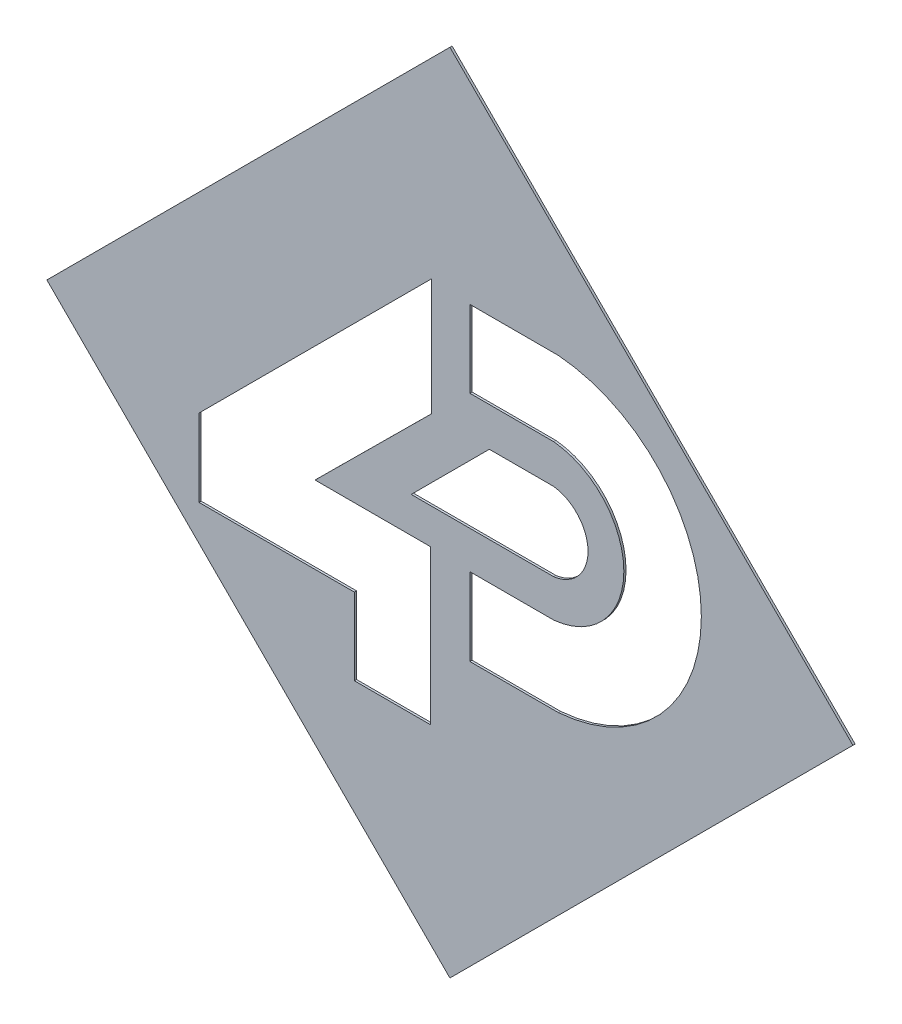
ISO-10303-21;
HEADER;
FILE_DESCRIPTION(('STEP AP214'),'2;1');
FILE_NAME('part.step','',(''),(''),'','','');
FILE_SCHEMA(('AUTOMOTIVE_DESIGN { 1 0 10303 214 1 1 1 1 }'));
ENDSEC;
DATA;
#1=APPLICATION_CONTEXT('core data for automotive mechanical design processes');
#2=APPLICATION_PROTOCOL_DEFINITION('international standard','automotive_design',2000,#1);
#3=PRODUCT_CONTEXT('',#1,'mechanical');
#4=PRODUCT('Part','Part','',(#3));
#5=PRODUCT_RELATED_PRODUCT_CATEGORY('part','',(#4));
#6=PRODUCT_DEFINITION_FORMATION('','',#4);
#7=PRODUCT_DEFINITION_CONTEXT('part definition',#1,'design');
#8=PRODUCT_DEFINITION('design','',#6,#7);
#9=PRODUCT_DEFINITION_SHAPE('','',#8);
#10=(LENGTH_UNIT() NAMED_UNIT(*) SI_UNIT(.MILLI.,.METRE.));
#11=(NAMED_UNIT(*) PLANE_ANGLE_UNIT() SI_UNIT($,.RADIAN.));
#12=(NAMED_UNIT(*) SI_UNIT($,.STERADIAN.) SOLID_ANGLE_UNIT());
#13=UNCERTAINTY_MEASURE_WITH_UNIT(LENGTH_MEASURE(1.E-05),#10,'distance_accuracy_value','');
#14=(GEOMETRIC_REPRESENTATION_CONTEXT(3) GLOBAL_UNCERTAINTY_ASSIGNED_CONTEXT((#13)) GLOBAL_UNIT_ASSIGNED_CONTEXT((#10,
#11,#12)) REPRESENTATION_CONTEXT('',''));
#15=CARTESIAN_POINT('',(0.,0.,0.));
#16=DIRECTION('',(0.,0.,1.));
#17=DIRECTION('',(1.,0.,0.));
#18=AXIS2_PLACEMENT_3D('',#15,#16,#17);
#19=CARTESIAN_POINT('',(10.217731417077,-10.2224459157152,0.));
#20=DIRECTION('',(0.,0.,1.));
#21=DIRECTION('',(1.,0.,0.));
#22=AXIS2_PLACEMENT_3D('',#19,#20,#21);
#23=PLANE('',#22);
#24=DIRECTION('',(0.,1.,0.));
#25=VECTOR('',#24,1.);
#26=CARTESIAN_POINT('',(10.6752695397316,-10.2224459157152,0.));
#27=LINE('',#26,#25);
#28=CARTESIAN_POINT('',(10.6752695397316,12.814151480448,0.));
#29=VERTEX_POINT('',#28);
#30=CARTESIAN_POINT('',(10.6752695397316,14.577178869165,0.));
#31=VERTEX_POINT('',#30);
#32=EDGE_CURVE('E146',#29,#31,#27,.T.);
#33=ORIENTED_EDGE('',*,*,#32,.F.);
#34=DIRECTION('',(1.,0.,0.));
#35=VECTOR('',#34,1.);
#36=CARTESIAN_POINT('',(10.217731417077,12.814151480448,0.));
#37=LINE('',#36,#35);
#38=CARTESIAN_POINT('',(12.5966622651888,12.814151480448,0.));
#39=VERTEX_POINT('',#38);
#40=EDGE_CURVE('E140',#39,#29,#37,.F.);
#41=ORIENTED_EDGE('',*,*,#40,.F.);
#42=CARTESIAN_POINT('',(12.4230260176183,11.0454761003808,0.));
#43=DIRECTION('',(0.,0.,-1.));
#44=DIRECTION('',(-1.,0.,0.));
#45=AXIS2_PLACEMENT_3D('',#42,#43,#44);
#46=CIRCLE('',#45,1.77717814147213);
#47=CARTESIAN_POINT('',(12.5966622651889,9.27680072031354,0.));
#48=VERTEX_POINT('',#47);
#49=EDGE_CURVE('E199',#48,#39,#46,.F.);
#50=ORIENTED_EDGE('',*,*,#49,.F.);
#51=DIRECTION('',(1.,0.,0.));
#52=VECTOR('',#51,1.);
#53=CARTESIAN_POINT('',(10.217731417077,9.27680072031354,0.));
#54=LINE('',#53,#52);
#55=CARTESIAN_POINT('',(10.6752695397316,9.27680072031354,0.));
#56=VERTEX_POINT('',#55);
#57=EDGE_CURVE('E158',#56,#48,#54,.T.);
#58=ORIENTED_EDGE('',*,*,#57,.F.);
#59=DIRECTION('',(0.,1.,0.));
#60=VECTOR('',#59,1.);
#61=CARTESIAN_POINT('',(10.6752695397316,-10.2224459157152,0.));
#62=LINE('',#61,#60);
#63=CARTESIAN_POINT('',(10.6752695397316,7.4957965885246,0.));
#64=VERTEX_POINT('',#63);
#65=EDGE_CURVE('E165',#64,#56,#62,.T.);
#66=ORIENTED_EDGE('',*,*,#65,.F.);
#67=DIRECTION('',(1.,0.,0.));
#68=VECTOR('',#67,1.);
#69=CARTESIAN_POINT('',(10.217731417077,7.4957965885246,0.));
#70=LINE('',#69,#68);
#71=CARTESIAN_POINT('',(12.7010926173601,7.4957965885246,0.));
#72=VERTEX_POINT('',#71);
#73=EDGE_CURVE('E171',#72,#64,#70,.F.);
#74=ORIENTED_EDGE('',*,*,#73,.F.);
#75=CARTESIAN_POINT('',(12.4228208807988,11.0364877288448,0.));
#76=DIRECTION('',(0.,0.,-1.));
#77=DIRECTION('',(-1.,0.,0.));
#78=AXIS2_PLACEMENT_3D('',#75,#76,#77);
#79=CIRCLE('',#78,3.55160934092007);
#80=CARTESIAN_POINT('',(12.7010926173602,14.577178869165,0.));
#81=VERTEX_POINT('',#80);
#82=EDGE_CURVE('E174',#72,#81,#79,.F.);
#83=ORIENTED_EDGE('',*,*,#82,.T.);
#84=DIRECTION('',(1.,0.,0.));
#85=VECTOR('',#84,1.);
#86=CARTESIAN_POINT('',(10.217731417077,14.577178869165,0.));
#87=LINE('',#86,#85);
#88=EDGE_CURVE('E152',#31,#81,#87,.T.);
#89=ORIENTED_EDGE('',*,*,#88,.F.);
#90=EDGE_LOOP('',(#33,#41,#50,#58,#66,#74,#83,#89));
#91=FACE_BOUND('',#90,.T.);
#92=DIRECTION('',(-0.707106781186548,-0.707106781186548,0.));
#93=VECTOR('',#92,1.);
#94=CARTESIAN_POINT('',(-2.42633022734762,2.42161572870947,0.));
#95=LINE('',#94,#93);
#96=CARTESIAN_POINT('',(9.79216750616329,14.6401134622204,0.));
#97=VERTEX_POINT('',#96);
#98=CARTESIAN_POINT('',(4.47357688341058,9.32152283946767,0.));
#99=VERTEX_POINT('',#98);
#100=EDGE_CURVE('E155',#97,#99,#95,.T.);
#101=ORIENTED_EDGE('',*,*,#100,.T.);
#102=DIRECTION('',(0.,1.,0.));
#103=VECTOR('',#102,1.);
#104=CARTESIAN_POINT('',(4.47357688341058,-10.2224459157152,0.));
#105=LINE('',#104,#103);
#106=CARTESIAN_POINT('',(4.47357688341058,7.54950829680011,0.));
#107=VERTEX_POINT('',#106);
#108=EDGE_CURVE('E223',#99,#107,#105,.F.);
#109=ORIENTED_EDGE('',*,*,#108,.T.);
#110=DIRECTION('',(1.,0.,0.));
#111=VECTOR('',#110,1.);
#112=CARTESIAN_POINT('',(10.217731417077,7.54950829680011,0.));
#113=LINE('',#112,#111);
#114=CARTESIAN_POINT('',(8.03181049413783,7.54950829680011,0.));
#115=VERTEX_POINT('',#114);
#116=EDGE_CURVE('E229',#107,#115,#113,.T.);
#117=ORIENTED_EDGE('',*,*,#116,.T.);
#118=DIRECTION('',(0.,1.,0.));
#119=VECTOR('',#118,1.);
#120=CARTESIAN_POINT('',(8.03181049413783,-10.2224459157152,0.));
#121=LINE('',#120,#119);
#122=CARTESIAN_POINT('',(8.03181049413783,5.79169827952468,0.));
#123=VERTEX_POINT('',#122);
#124=EDGE_CURVE('E238',#123,#115,#121,.T.);
#125=ORIENTED_EDGE('',*,*,#124,.F.);
#126=DIRECTION('',(1.,0.,0.));
#127=VECTOR('',#126,1.);
#128=CARTESIAN_POINT('',(10.217731417077,5.79169827952468,0.));
#129=LINE('',#128,#127);
#130=CARTESIAN_POINT('',(9.7718648546731,5.79169827952468,0.));
#131=VERTEX_POINT('',#130);
#132=EDGE_CURVE('E244',#131,#123,#129,.F.);
#133=ORIENTED_EDGE('',*,*,#132,.F.);
#134=DIRECTION('',(0.,1.,0.));
#135=VECTOR('',#134,1.);
#136=CARTESIAN_POINT('',(9.7718648546731,-10.2224459157152,0.));
#137=LINE('',#136,#135);
#138=CARTESIAN_POINT('',(9.7718648546731,9.32152283946767,0.));
#139=VERTEX_POINT('',#138);
#140=EDGE_CURVE('E250',#139,#131,#137,.F.);
#141=ORIENTED_EDGE('',*,*,#140,.F.);
#142=DIRECTION('',(1.,0.,0.));
#143=VECTOR('',#142,1.);
#144=CARTESIAN_POINT('',(10.217731417077,9.32152283946767,0.));
#145=LINE('',#144,#143);
#146=CARTESIAN_POINT('',(7.12982313173791,9.32152283946767,0.));
#147=VERTEX_POINT('',#146);
#148=EDGE_CURVE('E256',#147,#139,#145,.T.);
#149=ORIENTED_EDGE('',*,*,#148,.F.);
#150=DIRECTION('',(0.709780855705061,0.704422555625948,0.));
#151=VECTOR('',#150,1.);
#152=CARTESIAN_POINT('',(-1.08622687419273,1.16749769803277,0.));
#153=LINE('',#152,#151);
#154=CARTESIAN_POINT('',(9.79216750616329,11.9637685595585,0.));
#155=VERTEX_POINT('',#154);
#156=EDGE_CURVE('E259',#147,#155,#153,.T.);
#157=ORIENTED_EDGE('',*,*,#156,.T.);
#158=DIRECTION('',(0.,1.,0.));
#159=VECTOR('',#158,1.);
#160=CARTESIAN_POINT('',(9.79216750616329,-10.2224459157152,0.));
#161=LINE('',#160,#159);
#162=EDGE_CURVE('E265',#155,#97,#161,.T.);
#163=ORIENTED_EDGE('',*,*,#162,.T.);
#164=EDGE_LOOP('',(#101,#109,#117,#125,#133,#141,#149,#157,#163));
#165=FACE_BOUND('',#164,.T.);
#166=DIRECTION('',(0.707106781186547,0.707106781186548,0.));
#167=VECTOR('',#166,1.);
#168=CARTESIAN_POINT('',(-4.61658621500734,4.61187171636918,0.));
#169=LINE('',#168,#167);
#170=CARTESIAN_POINT('',(0.990477070848462,10.218935002225,0.));
#171=VERTEX_POINT('',#170);
#172=CARTESIAN_POINT('',(10.217731417077,19.4461893484536,0.));
#173=VERTEX_POINT('',#172);
#174=EDGE_CURVE('E268',#171,#173,#169,.T.);
#175=ORIENTED_EDGE('',*,*,#174,.T.);
#176=DIRECTION('',(0.707106781186548,-0.707106781186547,0.));
#177=VECTOR('',#176,1.);
#178=CARTESIAN_POINT('',(25.0520490491614,4.61187171636921,0.));
#179=LINE('',#178,#177);
#180=CARTESIAN_POINT('',(19.4449857633056,10.218935002225,0.));
#181=VERTEX_POINT('',#180);
#182=EDGE_CURVE('E277',#173,#181,#179,.T.);
#183=ORIENTED_EDGE('',*,*,#182,.T.);
#184=DIRECTION('',(-0.707106781186547,-0.707106781186548,0.));
#185=VECTOR('',#184,1.);
#186=CARTESIAN_POINT('',(4.61066813122124,-4.61538262985939,0.));
#187=LINE('',#186,#185);
#188=CARTESIAN_POINT('',(10.2177314170781,0.991680655997479,0.));
#189=VERTEX_POINT('',#188);
#190=EDGE_CURVE('E283',#181,#189,#187,.T.);
#191=ORIENTED_EDGE('',*,*,#190,.T.);
#192=DIRECTION('',(0.707106781186711,-0.707106781186385,0.));
#193=VECTOR('',#192,1.);
#194=CARTESIAN_POINT('',(15.824794702935,-4.61538262985467,0.));
#195=LINE('',#194,#193);
#196=EDGE_CURVE('E180',#171,#189,#195,.T.);
#197=ORIENTED_EDGE('',*,*,#196,.F.);
#198=EDGE_LOOP('',(#175,#183,#191,#197));
#199=FACE_BOUND('',#198,.T.);
#200=DIRECTION('',(-0.707106781186546,-0.707106781186549,0.));
#201=VECTOR('',#200,1.);
#202=CARTESIAN_POINT('',(-0.405234509784962,0.400520011146764,0.));
#203=LINE('',#202,#201);
#204=CARTESIAN_POINT('',(11.1202790704143,11.9260335913461,0.));
#205=VERTEX_POINT('',#204);
#206=CARTESIAN_POINT('',(9.33131784206016,10.1370723629919,0.));
#207=VERTEX_POINT('',#206);
#208=EDGE_CURVE('E136',#205,#207,#203,.T.);
#209=ORIENTED_EDGE('',*,*,#208,.T.);
#210=DIRECTION('',(1.,0.,0.));
#211=VECTOR('',#210,1.);
#212=CARTESIAN_POINT('',(10.217731417077,10.1370723629919,0.));
#213=LINE('',#212,#211);
#214=CARTESIAN_POINT('',(12.5966622651888,10.1370723629919,0.));
#215=VERTEX_POINT('',#214);
#216=EDGE_CURVE('E110',#215,#207,#213,.F.);
#217=ORIENTED_EDGE('',*,*,#216,.F.);
#218=CARTESIAN_POINT('',(12.4775949614775,11.031552977169,0.));
#219=DIRECTION('',(0.,0.,-1.));
#220=DIRECTION('',(-1.,0.,0.));
#221=AXIS2_PLACEMENT_3D('',#218,#219,#220);
#222=CIRCLE('',#221,0.902370540272512);
#223=CARTESIAN_POINT('',(12.5966622651888,11.9260335913461,0.));
#224=VERTEX_POINT('',#223);
#225=EDGE_CURVE('E20',#215,#224,#222,.F.);
#226=ORIENTED_EDGE('',*,*,#225,.T.);
#227=DIRECTION('',(1.,0.,0.));
#228=VECTOR('',#227,1.);
#229=CARTESIAN_POINT('',(10.217731417077,11.9260335913461,0.));
#230=LINE('',#229,#228);
#231=EDGE_CURVE('E115',#224,#205,#230,.F.);
#232=ORIENTED_EDGE('',*,*,#231,.T.);
#233=EDGE_LOOP('',(#209,#217,#226,#232));
#234=FACE_BOUND('',#233,.T.);
#235=ADVANCED_FACE('F17',(#91,#165,#199,#234),#23,.F.);
#236=CARTESIAN_POINT('',(10.217731417077,11.9260335913461,0.05));
#237=DIRECTION('',(0.,1.,0.));
#238=DIRECTION('',(0.,0.,1.));
#239=AXIS2_PLACEMENT_3D('',#236,#237,#238);
#240=PLANE('',#239);
#241=DIRECTION('',(0.,0.,-1.));
#242=VECTOR('',#241,1.);
#243=CARTESIAN_POINT('',(12.5966622651888,11.9260335913461,0.05));
#244=LINE('',#243,#242);
#245=CARTESIAN_POINT('',(12.5966622651889,11.9260335913461,0.05));
#246=VERTEX_POINT('',#245);
#247=EDGE_CURVE('E118',#224,#246,#244,.F.);
#248=ORIENTED_EDGE('',*,*,#247,.T.);
#249=DIRECTION('',(1.,0.,0.));
#250=VECTOR('',#249,1.);
#251=CARTESIAN_POINT('',(10.217731417077,11.9260335913461,0.05));
#252=LINE('',#251,#250);
#253=CARTESIAN_POINT('',(11.1202790704143,11.9260335913461,0.05));
#254=VERTEX_POINT('',#253);
#255=EDGE_CURVE('E198',#254,#246,#252,.T.);
#256=ORIENTED_EDGE('',*,*,#255,.F.);
#257=DIRECTION('',(0.,0.,1.));
#258=VECTOR('',#257,1.);
#259=CARTESIAN_POINT('',(11.1202790704143,11.9260335913461,0.05));
#260=LINE('',#259,#258);
#261=EDGE_CURVE('E121',#254,#205,#260,.F.);
#262=ORIENTED_EDGE('',*,*,#261,.T.);
#263=ORIENTED_EDGE('',*,*,#231,.F.);
#264=EDGE_LOOP('',(#248,#256,#262,#263));
#265=FACE_BOUND('',#264,.T.);
#266=ADVANCED_FACE('F116',(#265),#240,.F.);
#267=CARTESIAN_POINT('',(12.4775949614775,11.031552977169,0.05));
#268=DIRECTION('',(0.,0.,-1.));
#269=DIRECTION('',(-1.,0.,0.));
#270=AXIS2_PLACEMENT_3D('',#267,#268,#269);
#271=CYLINDRICAL_SURFACE('',#270,0.902370540272512);
#272=DIRECTION('',(0.,0.,1.));
#273=VECTOR('',#272,1.);
#274=CARTESIAN_POINT('',(12.5966622651888,10.1370723629919,0.05));
#275=LINE('',#274,#273);
#276=CARTESIAN_POINT('',(12.5966622651888,10.1370723629919,0.05));
#277=VERTEX_POINT('',#276);
#278=EDGE_CURVE('E184',#277,#215,#275,.F.);
#279=ORIENTED_EDGE('',*,*,#278,.F.);
#280=CARTESIAN_POINT('',(12.4775949614775,11.031552977169,0.05));
#281=DIRECTION('',(0.,0.,-1.));
#282=DIRECTION('',(-1.,0.,0.));
#283=AXIS2_PLACEMENT_3D('',#280,#281,#282);
#284=CIRCLE('',#283,0.902370540272512);
#285=EDGE_CURVE('E128',#246,#277,#284,.T.);
#286=ORIENTED_EDGE('',*,*,#285,.F.);
#287=ORIENTED_EDGE('',*,*,#247,.F.);
#288=ORIENTED_EDGE('',*,*,#225,.F.);
#289=EDGE_LOOP('',(#279,#286,#287,#288));
#290=FACE_BOUND('',#289,.T.);
#291=ADVANCED_FACE('F126',(#290),#271,.F.);
#292=CARTESIAN_POINT('',(10.217731417077,10.1370723629919,0.05));
#293=DIRECTION('',(0.,1.,0.));
#294=DIRECTION('',(0.,0.,1.));
#295=AXIS2_PLACEMENT_3D('',#292,#293,#294);
#296=PLANE('',#295);
#297=DIRECTION('',(1.,0.,0.));
#298=VECTOR('',#297,1.);
#299=CARTESIAN_POINT('',(10.217731417077,10.1370723629919,0.05));
#300=LINE('',#299,#298);
#301=CARTESIAN_POINT('',(9.33131784206016,10.1370723629919,0.05));
#302=VERTEX_POINT('',#301);
#303=EDGE_CURVE('E197',#277,#302,#300,.F.);
#304=ORIENTED_EDGE('',*,*,#303,.F.);
#305=ORIENTED_EDGE('',*,*,#278,.T.);
#306=ORIENTED_EDGE('',*,*,#216,.T.);
#307=DIRECTION('',(0.,0.,1.));
#308=VECTOR('',#307,1.);
#309=CARTESIAN_POINT('',(9.33131784206016,10.1370723629919,0.05));
#310=LINE('',#309,#308);
#311=EDGE_CURVE('E137',#207,#302,#310,.T.);
#312=ORIENTED_EDGE('',*,*,#311,.T.);
#313=EDGE_LOOP('',(#304,#305,#306,#312));
#314=FACE_BOUND('',#313,.T.);
#315=ADVANCED_FACE('F301',(#314),#296,.T.);
#316=CARTESIAN_POINT('',(-0.405234509784962,0.400520011146764,0.05));
#317=DIRECTION('',(-0.707106781186549,0.707106781186546,0.));
#318=DIRECTION('',(-0.707106781186546,-0.707106781186549,0.));
#319=AXIS2_PLACEMENT_3D('',#316,#317,#318);
#320=PLANE('',#319);
#321=ORIENTED_EDGE('',*,*,#261,.F.);
#322=DIRECTION('',(0.707106781186546,0.707106781186549,0.));
#323=VECTOR('',#322,1.);
#324=CARTESIAN_POINT('',(9.33131784206017,10.1370723629919,0.05));
#325=LINE('',#324,#323);
#326=EDGE_CURVE('E292',#302,#254,#325,.T.);
#327=ORIENTED_EDGE('',*,*,#326,.F.);
#328=ORIENTED_EDGE('',*,*,#311,.F.);
#329=ORIENTED_EDGE('',*,*,#208,.F.);
#330=EDGE_LOOP('',(#321,#327,#328,#329));
#331=FACE_BOUND('',#330,.T.);
#332=ADVANCED_FACE('F304',(#331),#320,.F.);
#333=CARTESIAN_POINT('',(15.824794702935,-4.61538262985467,0.05));
#334=DIRECTION('',(-0.707106781186385,-0.707106781186711,0.));
#335=DIRECTION('',(0.707106781186711,-0.707106781186385,0.));
#336=AXIS2_PLACEMENT_3D('',#333,#334,#335);
#337=PLANE('',#336);
#338=DIRECTION('',(0.707106781186548,-0.707106781186547,0.));
#339=VECTOR('',#338,1.);
#340=CARTESIAN_POINT('',(0.990477070848459,10.218935002225,0.05));
#341=LINE('',#340,#339);
#342=CARTESIAN_POINT('',(0.990477070848462,10.218935002225,0.05));
#343=VERTEX_POINT('',#342);
#344=CARTESIAN_POINT('',(10.2177314170781,0.991680655997479,0.05));
#345=VERTEX_POINT('',#344);
#346=EDGE_CURVE('E295',#343,#345,#341,.T.);
#347=ORIENTED_EDGE('',*,*,#346,.F.);
#348=DIRECTION('',(0.,0.,1.));
#349=VECTOR('',#348,1.);
#350=CARTESIAN_POINT('',(0.99047707084846,10.218935002225,0.05));
#351=LINE('',#350,#349);
#352=EDGE_CURVE('E271',#343,#171,#351,.F.);
#353=ORIENTED_EDGE('',*,*,#352,.T.);
#354=ORIENTED_EDGE('',*,*,#196,.T.);
#355=DIRECTION('',(0.,0.,1.));
#356=VECTOR('',#355,1.);
#357=CARTESIAN_POINT('',(10.217731417077,0.991680655996416,0.05));
#358=LINE('',#357,#356);
#359=EDGE_CURVE('E286',#189,#345,#358,.T.);
#360=ORIENTED_EDGE('',*,*,#359,.T.);
#361=EDGE_LOOP('',(#347,#353,#354,#360));
#362=FACE_BOUND('',#361,.T.);
#363=ADVANCED_FACE('F403',(#362),#337,.T.);
#364=CARTESIAN_POINT('',(4.61066813122124,-4.61538262985939,0.05));
#365=DIRECTION('',(-0.707106781186548,0.707106781186547,0.));
#366=DIRECTION('',(-0.707106781186547,-0.707106781186548,0.));
#367=AXIS2_PLACEMENT_3D('',#364,#365,#366);
#368=PLANE('',#367);
#369=DIRECTION('',(0.,0.,1.));
#370=VECTOR('',#369,1.);
#371=CARTESIAN_POINT('',(19.4449857633056,10.218935002225,0.05));
#372=LINE('',#371,#370);
#373=CARTESIAN_POINT('',(19.4449857633056,10.218935002225,0.05));
#374=VERTEX_POINT('',#373);
#375=EDGE_CURVE('E280',#181,#374,#372,.T.);
#376=ORIENTED_EDGE('',*,*,#375,.T.);
#377=DIRECTION('',(0.707106781186547,0.707106781186548,0.));
#378=VECTOR('',#377,1.);
#379=CARTESIAN_POINT('',(10.217731417077,0.991680655996415,0.05));
#380=LINE('',#379,#378);
#381=EDGE_CURVE('E391',#345,#374,#380,.T.);
#382=ORIENTED_EDGE('',*,*,#381,.F.);
#383=ORIENTED_EDGE('',*,*,#359,.F.);
#384=ORIENTED_EDGE('',*,*,#190,.F.);
#385=EDGE_LOOP('',(#376,#382,#383,#384));
#386=FACE_BOUND('',#385,.T.);
#387=ADVANCED_FACE('F591',(#386),#368,.F.);
#388=CARTESIAN_POINT('',(25.0520490491614,4.61187171636921,0.05));
#389=DIRECTION('',(-0.707106781186547,-0.707106781186548,0.));
#390=DIRECTION('',(0.707106781186548,-0.707106781186547,0.));
#391=AXIS2_PLACEMENT_3D('',#388,#389,#390);
#392=PLANE('',#391);
#393=DIRECTION('',(0.,0.,1.));
#394=VECTOR('',#393,1.);
#395=CARTESIAN_POINT('',(10.217731417077,19.4461893484536,0.05));
#396=LINE('',#395,#394);
#397=CARTESIAN_POINT('',(10.217731417077,19.4461893484536,0.05));
#398=VERTEX_POINT('',#397);
#399=EDGE_CURVE('E274',#173,#398,#396,.T.);
#400=ORIENTED_EDGE('',*,*,#399,.T.);
#401=DIRECTION('',(-0.707106781186548,0.707106781186547,0.));
#402=VECTOR('',#401,1.);
#403=CARTESIAN_POINT('',(19.4449857633056,10.218935002225,0.05));
#404=LINE('',#403,#402);
#405=EDGE_CURVE('E389',#374,#398,#404,.T.);
#406=ORIENTED_EDGE('',*,*,#405,.F.);
#407=ORIENTED_EDGE('',*,*,#375,.F.);
#408=ORIENTED_EDGE('',*,*,#182,.F.);
#409=EDGE_LOOP('',(#400,#406,#407,#408));
#410=FACE_BOUND('',#409,.T.);
#411=ADVANCED_FACE('F588',(#410),#392,.F.);
#412=CARTESIAN_POINT('',(-4.61658621500734,4.61187171636918,0.05));
#413=DIRECTION('',(0.707106781186548,-0.707106781186547,0.));
#414=DIRECTION('',(0.707106781186547,0.707106781186548,0.));
#415=AXIS2_PLACEMENT_3D('',#412,#413,#414);
#416=PLANE('',#415);
#417=ORIENTED_EDGE('',*,*,#352,.F.);
#418=DIRECTION('',(-0.707106781186547,-0.707106781186548,0.));
#419=VECTOR('',#418,1.);
#420=CARTESIAN_POINT('',(10.217731417077,19.4461893484536,0.05));
#421=LINE('',#420,#419);
#422=EDGE_CURVE('E386',#398,#343,#421,.T.);
#423=ORIENTED_EDGE('',*,*,#422,.F.);
#424=ORIENTED_EDGE('',*,*,#399,.F.);
#425=ORIENTED_EDGE('',*,*,#174,.F.);
#426=EDGE_LOOP('',(#417,#423,#424,#425));
#427=FACE_BOUND('',#426,.T.);
#428=ADVANCED_FACE('F409',(#427),#416,.F.);
#429=CARTESIAN_POINT('',(9.79216750616329,-10.2224459157152,0.05));
#430=DIRECTION('',(1.,0.,0.));
#431=DIRECTION('',(0.,0.,-1.));
#432=AXIS2_PLACEMENT_3D('',#429,#430,#431);
#433=PLANE('',#432);
#434=DIRECTION('',(0.,0.,1.));
#435=VECTOR('',#434,1.);
#436=CARTESIAN_POINT('',(9.7921675061633,11.9637685595585,0.05));
#437=LINE('',#436,#435);
#438=CARTESIAN_POINT('',(9.7921675061633,11.9637685595585,0.05));
#439=VERTEX_POINT('',#438);
#440=EDGE_CURVE('E262',#155,#439,#437,.T.);
#441=ORIENTED_EDGE('',*,*,#440,.T.);
#442=DIRECTION('',(0.,1.,0.));
#443=VECTOR('',#442,1.);
#444=CARTESIAN_POINT('',(9.79216750616329,-10.2224459157152,0.05));
#445=LINE('',#444,#443);
#446=CARTESIAN_POINT('',(9.79216750616329,14.6401134622204,0.05));
#447=VERTEX_POINT('',#446);
#448=EDGE_CURVE('E383',#447,#439,#445,.F.);
#449=ORIENTED_EDGE('',*,*,#448,.F.);
#450=DIRECTION('',(0.,0.,1.));
#451=VECTOR('',#450,1.);
#452=CARTESIAN_POINT('',(9.7921675061633,14.6401134622204,0.05));
#453=LINE('',#452,#451);
#454=EDGE_CURVE('E217',#447,#97,#453,.F.);
#455=ORIENTED_EDGE('',*,*,#454,.T.);
#456=ORIENTED_EDGE('',*,*,#162,.F.);
#457=EDGE_LOOP('',(#441,#449,#455,#456));
#458=FACE_BOUND('',#457,.T.);
#459=ADVANCED_FACE('F488',(#458),#433,.F.);
#460=CARTESIAN_POINT('',(-1.08622687419273,1.16749769803277,0.05));
#461=DIRECTION('',(0.704422555625948,-0.709780855705061,0.));
#462=DIRECTION('',(0.709780855705061,0.704422555625948,0.));
#463=AXIS2_PLACEMENT_3D('',#460,#461,#462);
#464=PLANE('',#463);
#465=DIRECTION('',(0.,0.,-1.));
#466=VECTOR('',#465,1.);
#467=CARTESIAN_POINT('',(7.12982313173791,9.32152283946767,0.05));
#468=LINE('',#467,#466);
#469=CARTESIAN_POINT('',(7.12982313173791,9.32152283946767,0.05));
#470=VERTEX_POINT('',#469);
#471=EDGE_CURVE('E253',#470,#147,#468,.T.);
#472=ORIENTED_EDGE('',*,*,#471,.F.);
#473=DIRECTION('',(-0.709780855705061,-0.704422555625947,0.));
#474=VECTOR('',#473,1.);
#475=CARTESIAN_POINT('',(9.79216750616329,11.9637685595585,0.05));
#476=LINE('',#475,#474);
#477=EDGE_CURVE('E380',#439,#470,#476,.T.);
#478=ORIENTED_EDGE('',*,*,#477,.F.);
#479=ORIENTED_EDGE('',*,*,#440,.F.);
#480=ORIENTED_EDGE('',*,*,#156,.F.);
#481=EDGE_LOOP('',(#472,#478,#479,#480));
#482=FACE_BOUND('',#481,.T.);
#483=ADVANCED_FACE('F492',(#482),#464,.F.);
#484=CARTESIAN_POINT('',(10.217731417077,9.32152283946767,0.05));
#485=DIRECTION('',(0.,-1.,0.));
#486=DIRECTION('',(0.,0.,-1.));
#487=AXIS2_PLACEMENT_3D('',#484,#485,#486);
#488=PLANE('',#487);
#489=DIRECTION('',(1.,0.,0.));
#490=VECTOR('',#489,1.);
#491=CARTESIAN_POINT('',(10.217731417077,9.32152283946767,0.05));
#492=LINE('',#491,#490);
#493=CARTESIAN_POINT('',(9.7718648546731,9.32152283946767,0.05));
#494=VERTEX_POINT('',#493);
#495=EDGE_CURVE('E377',#470,#494,#492,.T.);
#496=ORIENTED_EDGE('',*,*,#495,.F.);
#497=ORIENTED_EDGE('',*,*,#471,.T.);
#498=ORIENTED_EDGE('',*,*,#148,.T.);
#499=DIRECTION('',(0.,0.,1.));
#500=VECTOR('',#499,1.);
#501=CARTESIAN_POINT('',(9.7718648546731,9.32152283946767,0.05));
#502=LINE('',#501,#500);
#503=EDGE_CURVE('E247',#494,#139,#502,.F.);
#504=ORIENTED_EDGE('',*,*,#503,.F.);
#505=EDGE_LOOP('',(#496,#497,#498,#504));
#506=FACE_BOUND('',#505,.T.);
#507=ADVANCED_FACE('F494',(#506),#488,.T.);
#508=CARTESIAN_POINT('',(9.7718648546731,-10.2224459157152,0.05));
#509=DIRECTION('',(-1.,0.,0.));
#510=DIRECTION('',(0.,0.,1.));
#511=AXIS2_PLACEMENT_3D('',#508,#509,#510);
#512=PLANE('',#511);
#513=DIRECTION('',(0.,1.,0.));
#514=VECTOR('',#513,1.);
#515=CARTESIAN_POINT('',(9.7718648546731,-10.2224459157152,0.05));
#516=LINE('',#515,#514);
#517=CARTESIAN_POINT('',(9.7718648546731,5.79169827952468,0.05));
#518=VERTEX_POINT('',#517);
#519=EDGE_CURVE('E374',#494,#518,#516,.F.);
#520=ORIENTED_EDGE('',*,*,#519,.F.);
#521=ORIENTED_EDGE('',*,*,#503,.T.);
#522=ORIENTED_EDGE('',*,*,#140,.T.);
#523=DIRECTION('',(0.,0.,1.));
#524=VECTOR('',#523,1.);
#525=CARTESIAN_POINT('',(9.7718648546731,5.79169827952468,0.05));
#526=LINE('',#525,#524);
#527=EDGE_CURVE('E241',#518,#131,#526,.F.);
#528=ORIENTED_EDGE('',*,*,#527,.F.);
#529=EDGE_LOOP('',(#520,#521,#522,#528));
#530=FACE_BOUND('',#529,.T.);
#531=ADVANCED_FACE('F497',(#530),#512,.T.);
#532=CARTESIAN_POINT('',(10.217731417077,5.79169827952468,0.05));
#533=DIRECTION('',(0.,1.,0.));
#534=DIRECTION('',(0.,0.,1.));
#535=AXIS2_PLACEMENT_3D('',#532,#533,#534);
#536=PLANE('',#535);
#537=DIRECTION('',(1.,0.,0.));
#538=VECTOR('',#537,1.);
#539=CARTESIAN_POINT('',(10.217731417077,5.79169827952468,0.05));
#540=LINE('',#539,#538);
#541=CARTESIAN_POINT('',(8.03181049413783,5.79169827952468,0.05));
#542=VERTEX_POINT('',#541);
#543=EDGE_CURVE('E371',#518,#542,#540,.F.);
#544=ORIENTED_EDGE('',*,*,#543,.F.);
#545=ORIENTED_EDGE('',*,*,#527,.T.);
#546=ORIENTED_EDGE('',*,*,#132,.T.);
#547=DIRECTION('',(0.,0.,-1.));
#548=VECTOR('',#547,1.);
#549=CARTESIAN_POINT('',(8.03181049413783,5.79169827952468,0.05));
#550=LINE('',#549,#548);
#551=EDGE_CURVE('E235',#542,#123,#550,.T.);
#552=ORIENTED_EDGE('',*,*,#551,.F.);
#553=EDGE_LOOP('',(#544,#545,#546,#552));
#554=FACE_BOUND('',#553,.T.);
#555=ADVANCED_FACE('F500',(#554),#536,.T.);
#556=CARTESIAN_POINT('',(8.03181049413783,-10.2224459157152,0.05));
#557=DIRECTION('',(1.,0.,0.));
#558=DIRECTION('',(0.,0.,-1.));
#559=AXIS2_PLACEMENT_3D('',#556,#557,#558);
#560=PLANE('',#559);
#561=DIRECTION('',(0.,1.,0.));
#562=VECTOR('',#561,1.);
#563=CARTESIAN_POINT('',(8.03181049413783,-10.2224459157152,0.05));
#564=LINE('',#563,#562);
#565=CARTESIAN_POINT('',(8.03181049413783,7.54950829680011,0.05));
#566=VERTEX_POINT('',#565);
#567=EDGE_CURVE('E368',#542,#566,#564,.T.);
#568=ORIENTED_EDGE('',*,*,#567,.F.);
#569=ORIENTED_EDGE('',*,*,#551,.T.);
#570=ORIENTED_EDGE('',*,*,#124,.T.);
#571=DIRECTION('',(0.,0.,-1.));
#572=VECTOR('',#571,1.);
#573=CARTESIAN_POINT('',(8.03181049413783,7.54950829680011,0.05));
#574=LINE('',#573,#572);
#575=EDGE_CURVE('E232',#115,#566,#574,.F.);
#576=ORIENTED_EDGE('',*,*,#575,.T.);
#577=EDGE_LOOP('',(#568,#569,#570,#576));
#578=FACE_BOUND('',#577,.T.);
#579=ADVANCED_FACE('F502',(#578),#560,.T.);
#580=CARTESIAN_POINT('',(10.217731417077,7.54950829680011,0.05));
#581=DIRECTION('',(0.,-1.,0.));
#582=DIRECTION('',(0.,0.,-1.));
#583=AXIS2_PLACEMENT_3D('',#580,#581,#582);
#584=PLANE('',#583);
#585=DIRECTION('',(0.,0.,1.));
#586=VECTOR('',#585,1.);
#587=CARTESIAN_POINT('',(4.47357688341058,7.54950829680011,0.05));
#588=LINE('',#587,#586);
#589=CARTESIAN_POINT('',(4.47357688341058,7.54950829680011,0.05));
#590=VERTEX_POINT('',#589);
#591=EDGE_CURVE('E226',#107,#590,#588,.T.);
#592=ORIENTED_EDGE('',*,*,#591,.T.);
#593=DIRECTION('',(1.,0.,0.));
#594=VECTOR('',#593,1.);
#595=CARTESIAN_POINT('',(10.217731417077,7.54950829680011,0.05));
#596=LINE('',#595,#594);
#597=EDGE_CURVE('E365',#566,#590,#596,.F.);
#598=ORIENTED_EDGE('',*,*,#597,.F.);
#599=ORIENTED_EDGE('',*,*,#575,.F.);
#600=ORIENTED_EDGE('',*,*,#116,.F.);
#601=EDGE_LOOP('',(#592,#598,#599,#600));
#602=FACE_BOUND('',#601,.T.);
#603=ADVANCED_FACE('F484',(#602),#584,.F.);
#604=CARTESIAN_POINT('',(4.47357688341058,-10.2224459157152,0.05));
#605=DIRECTION('',(-1.,0.,0.));
#606=DIRECTION('',(0.,0.,1.));
#607=AXIS2_PLACEMENT_3D('',#604,#605,#606);
#608=PLANE('',#607);
#609=DIRECTION('',(0.,0.,1.));
#610=VECTOR('',#609,1.);
#611=CARTESIAN_POINT('',(4.47357688341059,9.32152283946767,0.05));
#612=LINE('',#611,#610);
#613=CARTESIAN_POINT('',(4.47357688341058,9.32152283946767,0.05));
#614=VERTEX_POINT('',#613);
#615=EDGE_CURVE('E220',#99,#614,#612,.T.);
#616=ORIENTED_EDGE('',*,*,#615,.T.);
#617=DIRECTION('',(0.,1.,0.));
#618=VECTOR('',#617,1.);
#619=CARTESIAN_POINT('',(4.47357688341058,-10.2224459157152,0.05));
#620=LINE('',#619,#618);
#621=EDGE_CURVE('E355',#590,#614,#620,.T.);
#622=ORIENTED_EDGE('',*,*,#621,.F.);
#623=ORIENTED_EDGE('',*,*,#591,.F.);
#624=ORIENTED_EDGE('',*,*,#108,.F.);
#625=EDGE_LOOP('',(#616,#622,#623,#624));
#626=FACE_BOUND('',#625,.T.);
#627=ADVANCED_FACE('F474',(#626),#608,.F.);
#628=CARTESIAN_POINT('',(-2.42633022734762,2.42161572870947,0.05));
#629=DIRECTION('',(-0.707106781186548,0.707106781186548,0.));
#630=DIRECTION('',(-0.707106781186548,-0.707106781186548,0.));
#631=AXIS2_PLACEMENT_3D('',#628,#629,#630);
#632=PLANE('',#631);
#633=ORIENTED_EDGE('',*,*,#454,.F.);
#634=DIRECTION('',(0.707106781186547,0.707106781186548,0.));
#635=VECTOR('',#634,1.);
#636=CARTESIAN_POINT('',(4.47357688341058,9.32152283946767,0.05));
#637=LINE('',#636,#635);
#638=EDGE_CURVE('E352',#614,#447,#637,.T.);
#639=ORIENTED_EDGE('',*,*,#638,.F.);
#640=ORIENTED_EDGE('',*,*,#615,.F.);
#641=ORIENTED_EDGE('',*,*,#100,.F.);
#642=EDGE_LOOP('',(#633,#639,#640,#641));
#643=FACE_BOUND('',#642,.T.);
#644=ADVANCED_FACE('F479',(#643),#632,.F.);
#645=CARTESIAN_POINT('',(10.217731417077,14.577178869165,0.05));
#646=DIRECTION('',(0.,-1.,0.));
#647=DIRECTION('',(0.,0.,-1.));
#648=AXIS2_PLACEMENT_3D('',#645,#646,#647);
#649=PLANE('',#648);
#650=DIRECTION('',(1.,0.,0.));
#651=VECTOR('',#650,1.);
#652=CARTESIAN_POINT('',(10.217731417077,14.577178869165,0.05));
#653=LINE('',#652,#651);
#654=CARTESIAN_POINT('',(10.6752695397316,14.577178869165,0.05));
#655=VERTEX_POINT('',#654);
#656=CARTESIAN_POINT('',(12.7010926173602,14.577178869165,0.05));
#657=VERTEX_POINT('',#656);
#658=EDGE_CURVE('E195',#655,#657,#653,.T.);
#659=ORIENTED_EDGE('',*,*,#658,.F.);
#660=DIRECTION('',(0.,0.,-1.));
#661=VECTOR('',#660,1.);
#662=CARTESIAN_POINT('',(10.6752695397316,14.577178869165,0.05));
#663=LINE('',#662,#661);
#664=EDGE_CURVE('E149',#31,#655,#663,.F.);
#665=ORIENTED_EDGE('',*,*,#664,.F.);
#666=ORIENTED_EDGE('',*,*,#88,.T.);
#667=DIRECTION('',(0.,0.,-1.));
#668=VECTOR('',#667,1.);
#669=CARTESIAN_POINT('',(12.7010926173601,14.577178869165,0.05));
#670=LINE('',#669,#668);
#671=EDGE_CURVE('E154',#81,#657,#670,.F.);
#672=ORIENTED_EDGE('',*,*,#671,.T.);
#673=EDGE_LOOP('',(#659,#665,#666,#672));
#674=FACE_BOUND('',#673,.T.);
#675=ADVANCED_FACE('F538',(#674),#649,.T.);
#676=CARTESIAN_POINT('',(12.4228208807988,11.0364877288448,0.05));
#677=DIRECTION('',(0.,0.,-1.));
#678=DIRECTION('',(-1.,0.,0.));
#679=AXIS2_PLACEMENT_3D('',#676,#677,#678);
#680=CYLINDRICAL_SURFACE('',#679,3.55160934092007);
#681=DIRECTION('',(0.,0.,1.));
#682=VECTOR('',#681,1.);
#683=CARTESIAN_POINT('',(12.7010926173601,7.4957965885246,0.05));
#684=LINE('',#683,#682);
#685=CARTESIAN_POINT('',(12.7010926173601,7.4957965885246,0.05));
#686=VERTEX_POINT('',#685);
#687=EDGE_CURVE('E168',#686,#72,#684,.F.);
#688=ORIENTED_EDGE('',*,*,#687,.F.);
#689=CARTESIAN_POINT('',(12.4228208807988,11.0364877288448,0.05));
#690=DIRECTION('',(0.,0.,-1.));
#691=DIRECTION('',(-1.,0.,0.));
#692=AXIS2_PLACEMENT_3D('',#689,#690,#691);
#693=CIRCLE('',#692,3.55160934092007);
#694=EDGE_CURVE('E191',#657,#686,#693,.T.);
#695=ORIENTED_EDGE('',*,*,#694,.F.);
#696=ORIENTED_EDGE('',*,*,#671,.F.);
#697=ORIENTED_EDGE('',*,*,#82,.F.);
#698=EDGE_LOOP('',(#688,#695,#696,#697));
#699=FACE_BOUND('',#698,.T.);
#700=ADVANCED_FACE('F346',(#699),#680,.F.);
#701=CARTESIAN_POINT('',(10.217731417077,7.4957965885246,0.05));
#702=DIRECTION('',(0.,1.,0.));
#703=DIRECTION('',(0.,0.,1.));
#704=AXIS2_PLACEMENT_3D('',#701,#702,#703);
#705=PLANE('',#704);
#706=DIRECTION('',(1.,0.,0.));
#707=VECTOR('',#706,1.);
#708=CARTESIAN_POINT('',(10.217731417077,7.4957965885246,0.05));
#709=LINE('',#708,#707);
#710=CARTESIAN_POINT('',(10.6752695397316,7.4957965885246,0.05));
#711=VERTEX_POINT('',#710);
#712=EDGE_CURVE('E194',#686,#711,#709,.F.);
#713=ORIENTED_EDGE('',*,*,#712,.F.);
#714=ORIENTED_EDGE('',*,*,#687,.T.);
#715=ORIENTED_EDGE('',*,*,#73,.T.);
#716=DIRECTION('',(0.,0.,-1.));
#717=VECTOR('',#716,1.);
#718=CARTESIAN_POINT('',(10.6752695397316,7.4957965885246,0.05));
#719=LINE('',#718,#717);
#720=EDGE_CURVE('E162',#711,#64,#719,.T.);
#721=ORIENTED_EDGE('',*,*,#720,.F.);
#722=EDGE_LOOP('',(#713,#714,#715,#721));
#723=FACE_BOUND('',#722,.T.);
#724=ADVANCED_FACE('F342',(#723),#705,.T.);
#725=CARTESIAN_POINT('',(10.6752695397316,-10.2224459157152,0.05));
#726=DIRECTION('',(1.,0.,0.));
#727=DIRECTION('',(0.,0.,-1.));
#728=AXIS2_PLACEMENT_3D('',#725,#726,#727);
#729=PLANE('',#728);
#730=DIRECTION('',(0.,1.,0.));
#731=VECTOR('',#730,1.);
#732=CARTESIAN_POINT('',(10.6752695397316,-10.2224459157152,0.05));
#733=LINE('',#732,#731);
#734=CARTESIAN_POINT('',(10.6752695397316,9.27680072031354,0.05));
#735=VERTEX_POINT('',#734);
#736=EDGE_CURVE('E329',#711,#735,#733,.T.);
#737=ORIENTED_EDGE('',*,*,#736,.F.);
#738=ORIENTED_EDGE('',*,*,#720,.T.);
#739=ORIENTED_EDGE('',*,*,#65,.T.);
#740=DIRECTION('',(0.,0.,-1.));
#741=VECTOR('',#740,1.);
#742=CARTESIAN_POINT('',(10.6752695397316,9.27680072031354,0.05));
#743=LINE('',#742,#741);
#744=EDGE_CURVE('E161',#735,#56,#743,.T.);
#745=ORIENTED_EDGE('',*,*,#744,.F.);
#746=EDGE_LOOP('',(#737,#738,#739,#745));
#747=FACE_BOUND('',#746,.T.);
#748=ADVANCED_FACE('F338',(#747),#729,.T.);
#749=CARTESIAN_POINT('',(10.217731417077,9.27680072031354,0.05));
#750=DIRECTION('',(0.,-1.,0.));
#751=DIRECTION('',(0.,0.,-1.));
#752=AXIS2_PLACEMENT_3D('',#749,#750,#751);
#753=PLANE('',#752);
#754=DIRECTION('',(1.,0.,0.));
#755=VECTOR('',#754,1.);
#756=CARTESIAN_POINT('',(10.217731417077,9.27680072031354,0.05));
#757=LINE('',#756,#755);
#758=CARTESIAN_POINT('',(12.5966622651889,9.27680072031354,0.05));
#759=VERTEX_POINT('',#758);
#760=EDGE_CURVE('E190',#735,#759,#757,.T.);
#761=ORIENTED_EDGE('',*,*,#760,.F.);
#762=ORIENTED_EDGE('',*,*,#744,.T.);
#763=ORIENTED_EDGE('',*,*,#57,.T.);
#764=DIRECTION('',(0.,0.,-1.));
#765=VECTOR('',#764,1.);
#766=CARTESIAN_POINT('',(12.5966622651888,9.27680072031354,0.05));
#767=LINE('',#766,#765);
#768=EDGE_CURVE('E143',#759,#48,#767,.T.);
#769=ORIENTED_EDGE('',*,*,#768,.F.);
#770=EDGE_LOOP('',(#761,#762,#763,#769));
#771=FACE_BOUND('',#770,.T.);
#772=ADVANCED_FACE('F527',(#771),#753,.T.);
#773=CARTESIAN_POINT('',(12.4230260176183,11.0454761003808,0.05));
#774=DIRECTION('',(0.,0.,-1.));
#775=DIRECTION('',(-1.,0.,0.));
#776=AXIS2_PLACEMENT_3D('',#773,#774,#775);
#777=CYLINDRICAL_SURFACE('',#776,1.77717814147213);
#778=CARTESIAN_POINT('',(12.4230260176183,11.0454761003808,0.05));
#779=DIRECTION('',(0.,0.,-1.));
#780=DIRECTION('',(-1.,0.,0.));
#781=AXIS2_PLACEMENT_3D('',#778,#779,#780);
#782=CIRCLE('',#781,1.77717814147213);
#783=CARTESIAN_POINT('',(12.5966622651888,12.814151480448,0.05));
#784=VERTEX_POINT('',#783);
#785=EDGE_CURVE('E187',#759,#784,#782,.F.);
#786=ORIENTED_EDGE('',*,*,#785,.F.);
#787=ORIENTED_EDGE('',*,*,#768,.T.);
#788=ORIENTED_EDGE('',*,*,#49,.T.);
#789=DIRECTION('',(0.,0.,1.));
#790=VECTOR('',#789,1.);
#791=CARTESIAN_POINT('',(12.5966622651888,12.814151480448,0.05));
#792=LINE('',#791,#790);
#793=EDGE_CURVE('E142',#784,#39,#792,.F.);
#794=ORIENTED_EDGE('',*,*,#793,.F.);
#795=EDGE_LOOP('',(#786,#787,#788,#794));
#796=FACE_BOUND('',#795,.T.);
#797=ADVANCED_FACE('F524',(#796),#777,.T.);
#798=CARTESIAN_POINT('',(10.217731417077,12.814151480448,0.05));
#799=DIRECTION('',(0.,1.,0.));
#800=DIRECTION('',(0.,0.,1.));
#801=AXIS2_PLACEMENT_3D('',#798,#799,#800);
#802=PLANE('',#801);
#803=DIRECTION('',(1.,0.,0.));
#804=VECTOR('',#803,1.);
#805=CARTESIAN_POINT('',(10.217731417077,12.814151480448,0.05));
#806=LINE('',#805,#804);
#807=CARTESIAN_POINT('',(10.6752695397316,12.814151480448,0.05));
#808=VERTEX_POINT('',#807);
#809=EDGE_CURVE('E26',#784,#808,#806,.F.);
#810=ORIENTED_EDGE('',*,*,#809,.F.);
#811=ORIENTED_EDGE('',*,*,#793,.T.);
#812=ORIENTED_EDGE('',*,*,#40,.T.);
#813=DIRECTION('',(0.,0.,-1.));
#814=VECTOR('',#813,1.);
#815=CARTESIAN_POINT('',(10.6752695397316,12.814151480448,0.05));
#816=LINE('',#815,#814);
#817=EDGE_CURVE('E35',#808,#29,#816,.T.);
#818=ORIENTED_EDGE('',*,*,#817,.F.);
#819=EDGE_LOOP('',(#810,#811,#812,#818));
#820=FACE_BOUND('',#819,.T.);
#821=ADVANCED_FACE('F518',(#820),#802,.T.);
#822=CARTESIAN_POINT('',(10.6752695397316,-10.2224459157152,0.05));
#823=DIRECTION('',(1.,0.,0.));
#824=DIRECTION('',(0.,0.,-1.));
#825=AXIS2_PLACEMENT_3D('',#822,#823,#824);
#826=PLANE('',#825);
#827=DIRECTION('',(0.,1.,0.));
#828=VECTOR('',#827,1.);
#829=CARTESIAN_POINT('',(10.6752695397316,-10.2224459157152,0.05));
#830=LINE('',#829,#828);
#831=EDGE_CURVE('E11',#808,#655,#830,.T.);
#832=ORIENTED_EDGE('',*,*,#831,.F.);
#833=ORIENTED_EDGE('',*,*,#817,.T.);
#834=ORIENTED_EDGE('',*,*,#32,.T.);
#835=ORIENTED_EDGE('',*,*,#664,.T.);
#836=EDGE_LOOP('',(#832,#833,#834,#835));
#837=FACE_BOUND('',#836,.T.);
#838=ADVANCED_FACE('F513',(#837),#826,.T.);
#839=CARTESIAN_POINT('',(10.217731417077,-10.2224459157152,0.05));
#840=DIRECTION('',(0.,0.,1.));
#841=DIRECTION('',(1.,0.,0.));
#842=AXIS2_PLACEMENT_3D('',#839,#840,#841);
#843=PLANE('',#842);
#844=ORIENTED_EDGE('',*,*,#809,.T.);
#845=ORIENTED_EDGE('',*,*,#831,.T.);
#846=ORIENTED_EDGE('',*,*,#658,.T.);
#847=ORIENTED_EDGE('',*,*,#694,.T.);
#848=ORIENTED_EDGE('',*,*,#712,.T.);
#849=ORIENTED_EDGE('',*,*,#736,.T.);
#850=ORIENTED_EDGE('',*,*,#760,.T.);
#851=ORIENTED_EDGE('',*,*,#785,.T.);
#852=EDGE_LOOP('',(#844,#845,#846,#847,#848,#849,#850,#851));
#853=FACE_BOUND('',#852,.T.);
#854=ORIENTED_EDGE('',*,*,#621,.T.);
#855=ORIENTED_EDGE('',*,*,#638,.T.);
#856=ORIENTED_EDGE('',*,*,#448,.T.);
#857=ORIENTED_EDGE('',*,*,#477,.T.);
#858=ORIENTED_EDGE('',*,*,#495,.T.);
#859=ORIENTED_EDGE('',*,*,#519,.T.);
#860=ORIENTED_EDGE('',*,*,#543,.T.);
#861=ORIENTED_EDGE('',*,*,#567,.T.);
#862=ORIENTED_EDGE('',*,*,#597,.T.);
#863=EDGE_LOOP('',(#854,#855,#856,#857,#858,#859,#860,#861,#862));
#864=FACE_BOUND('',#863,.T.);
#865=ORIENTED_EDGE('',*,*,#405,.T.);
#866=ORIENTED_EDGE('',*,*,#422,.T.);
#867=ORIENTED_EDGE('',*,*,#346,.T.);
#868=ORIENTED_EDGE('',*,*,#381,.T.);
#869=EDGE_LOOP('',(#865,#866,#867,#868));
#870=FACE_BOUND('',#869,.T.);
#871=ORIENTED_EDGE('',*,*,#303,.T.);
#872=ORIENTED_EDGE('',*,*,#326,.T.);
#873=ORIENTED_EDGE('',*,*,#255,.T.);
#874=ORIENTED_EDGE('',*,*,#285,.T.);
#875=EDGE_LOOP('',(#871,#872,#873,#874));
#876=FACE_BOUND('',#875,.T.);
#877=ADVANCED_FACE('F306',(#853,#864,#870,#876),#843,.T.);
#878=CLOSED_SHELL('',(#235,#266,#291,#315,#332,#363,#387,#411,#428,#459,#483,#507,#531,#555,
#579,#603,#627,#644,#675,#700,#724,#748,#772,#797,#821,#838,#877));
#879=MANIFOLD_SOLID_BREP('B1',#878);
#880=ADVANCED_BREP_SHAPE_REPRESENTATION('',(#18,#879),#14);
#881=SHAPE_DEFINITION_REPRESENTATION(#9,#880);
ENDSEC;
END-ISO-10303-21;
